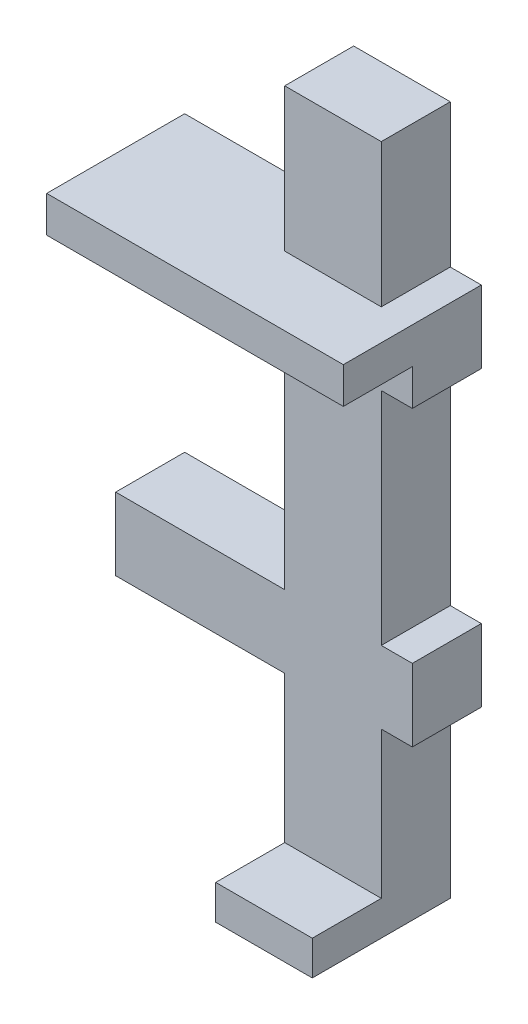
ISO-10303-21;
HEADER;
FILE_DESCRIPTION(('STEP AP214'),'2;1');
FILE_NAME('part.step','',(''),(''),'','','');
FILE_SCHEMA(('AUTOMOTIVE_DESIGN { 1 0 10303 214 1 1 1 1 }'));
ENDSEC;
DATA;
#1=APPLICATION_CONTEXT('core data for automotive mechanical design processes');
#2=APPLICATION_PROTOCOL_DEFINITION('international standard','automotive_design',2000,#1);
#3=PRODUCT_CONTEXT('',#1,'mechanical');
#4=PRODUCT('Part','Part','',(#3));
#5=PRODUCT_RELATED_PRODUCT_CATEGORY('part','',(#4));
#6=PRODUCT_DEFINITION_FORMATION('','',#4);
#7=PRODUCT_DEFINITION_CONTEXT('part definition',#1,'design');
#8=PRODUCT_DEFINITION('design','',#6,#7);
#9=PRODUCT_DEFINITION_SHAPE('','',#8);
#10=(LENGTH_UNIT() NAMED_UNIT(*) SI_UNIT(.MILLI.,.METRE.));
#11=(NAMED_UNIT(*) PLANE_ANGLE_UNIT() SI_UNIT($,.RADIAN.));
#12=(NAMED_UNIT(*) SI_UNIT($,.STERADIAN.) SOLID_ANGLE_UNIT());
#13=UNCERTAINTY_MEASURE_WITH_UNIT(LENGTH_MEASURE(1.E-05),#10,'distance_accuracy_value','');
#14=(GEOMETRIC_REPRESENTATION_CONTEXT(3) GLOBAL_UNCERTAINTY_ASSIGNED_CONTEXT((#13)) GLOBAL_UNIT_ASSIGNED_CONTEXT((#10,
#11,#12)) REPRESENTATION_CONTEXT('',''));
#15=CARTESIAN_POINT('',(0.,0.,0.));
#16=DIRECTION('',(0.,0.,1.));
#17=DIRECTION('',(1.,0.,0.));
#18=AXIS2_PLACEMENT_3D('',#15,#16,#17);
#19=CARTESIAN_POINT('',(0.,0.,4.));
#20=DIRECTION('',(0.,0.,1.));
#21=DIRECTION('',(1.,0.,0.));
#22=AXIS2_PLACEMENT_3D('',#19,#20,#21);
#23=PLANE('',#22);
#24=DIRECTION('',(0.,1.,0.));
#25=VECTOR('',#24,1.);
#26=CARTESIAN_POINT('',(4.6,11.7,4.));
#27=LINE('',#26,#25);
#28=CARTESIAN_POINT('',(4.6,7.5,4.));
#29=VERTEX_POINT('',#28);
#30=CARTESIAN_POINT('',(4.6,9.6,4.));
#31=VERTEX_POINT('',#30);
#32=EDGE_CURVE('E337',#29,#31,#27,.T.);
#33=ORIENTED_EDGE('',*,*,#32,.T.);
#34=DIRECTION('',(1.,0.,0.));
#35=VECTOR('',#34,1.);
#36=CARTESIAN_POINT('',(-12.6,9.6,4.));
#37=LINE('',#36,#35);
#38=CARTESIAN_POINT('',(-12.6,9.6,4.));
#39=VERTEX_POINT('',#38);
#40=EDGE_CURVE('E485',#39,#31,#37,.T.);
#41=ORIENTED_EDGE('',*,*,#40,.F.);
#42=DIRECTION('',(0.,1.,0.));
#43=VECTOR('',#42,1.);
#44=CARTESIAN_POINT('',(-12.6,11.7,4.));
#45=LINE('',#44,#43);
#46=CARTESIAN_POINT('',(-12.6,7.5,4.));
#47=VERTEX_POINT('',#46);
#48=EDGE_CURVE('E238',#47,#39,#45,.T.);
#49=ORIENTED_EDGE('',*,*,#48,.F.);
#50=DIRECTION('',(1.,0.,0.));
#51=VECTOR('',#50,1.);
#52=CARTESIAN_POINT('',(-4.6,7.5,4.));
#53=LINE('',#52,#51);
#54=CARTESIAN_POINT('',(-2.8,7.5,4.));
#55=VERTEX_POINT('',#54);
#56=EDGE_CURVE('E373',#47,#55,#53,.T.);
#57=ORIENTED_EDGE('',*,*,#56,.T.);
#58=DIRECTION('',(0.,1.,0.));
#59=VECTOR('',#58,1.);
#60=CARTESIAN_POINT('',(-2.8,-20.,4.));
#61=LINE('',#60,#59);
#62=CARTESIAN_POINT('',(-2.8,-5.3,4.));
#63=VERTEX_POINT('',#62);
#64=EDGE_CURVE('E422',#63,#55,#61,.T.);
#65=ORIENTED_EDGE('',*,*,#64,.F.);
#66=DIRECTION('',(1.,0.,0.));
#67=VECTOR('',#66,1.);
#68=CARTESIAN_POINT('',(-4.6,-5.3,4.));
#69=LINE('',#68,#67);
#70=CARTESIAN_POINT('',(-12.6,-5.3,4.));
#71=VERTEX_POINT('',#70);
#72=EDGE_CURVE('E318',#71,#63,#69,.T.);
#73=ORIENTED_EDGE('',*,*,#72,.F.);
#74=DIRECTION('',(0.,1.,0.));
#75=VECTOR('',#74,1.);
#76=CARTESIAN_POINT('',(-12.6,-5.3,4.));
#77=LINE('',#76,#75);
#78=CARTESIAN_POINT('',(-12.6,-9.5,4.));
#79=VERTEX_POINT('',#78);
#80=EDGE_CURVE('E245',#79,#71,#77,.T.);
#81=ORIENTED_EDGE('',*,*,#80,.F.);
#82=DIRECTION('',(1.,0.,0.));
#83=VECTOR('',#82,1.);
#84=CARTESIAN_POINT('',(-4.6,-9.5,4.));
#85=LINE('',#84,#83);
#86=CARTESIAN_POINT('',(-2.8,-9.5,4.));
#87=VERTEX_POINT('',#86);
#88=EDGE_CURVE('E321',#79,#87,#85,.T.);
#89=ORIENTED_EDGE('',*,*,#88,.T.);
#90=CARTESIAN_POINT('',(-2.8,-18.,4.));
#91=VERTEX_POINT('',#90);
#92=EDGE_CURVE('E417',#91,#87,#61,.T.);
#93=ORIENTED_EDGE('',*,*,#92,.F.);
#94=DIRECTION('',(-1.,0.,0.));
#95=VECTOR('',#94,1.);
#96=CARTESIAN_POINT('',(-2.8,-18.,4.));
#97=LINE('',#96,#95);
#98=CARTESIAN_POINT('',(2.8,-18.,4.));
#99=VERTEX_POINT('',#98);
#100=EDGE_CURVE('E381',#99,#91,#97,.T.);
#101=ORIENTED_EDGE('',*,*,#100,.F.);
#102=DIRECTION('',(0.,1.,0.));
#103=VECTOR('',#102,1.);
#104=CARTESIAN_POINT('',(2.8,-20.,4.));
#105=LINE('',#104,#103);
#106=CARTESIAN_POINT('',(2.8,-9.5,4.));
#107=VERTEX_POINT('',#106);
#108=EDGE_CURVE('E408',#99,#107,#105,.T.);
#109=ORIENTED_EDGE('',*,*,#108,.T.);
#110=DIRECTION('',(-1.,0.,0.));
#111=VECTOR('',#110,1.);
#112=CARTESIAN_POINT('',(4.6,-9.5,4.));
#113=LINE('',#112,#111);
#114=CARTESIAN_POINT('',(4.6,-9.5,4.));
#115=VERTEX_POINT('',#114);
#116=EDGE_CURVE('E294',#115,#107,#113,.T.);
#117=ORIENTED_EDGE('',*,*,#116,.F.);
#118=DIRECTION('',(0.,-1.,0.));
#119=VECTOR('',#118,1.);
#120=CARTESIAN_POINT('',(4.6,-9.5,4.));
#121=LINE('',#120,#119);
#122=CARTESIAN_POINT('',(4.6,-5.3,4.));
#123=VERTEX_POINT('',#122);
#124=EDGE_CURVE('E280',#123,#115,#121,.T.);
#125=ORIENTED_EDGE('',*,*,#124,.F.);
#126=DIRECTION('',(-1.,0.,0.));
#127=VECTOR('',#126,1.);
#128=CARTESIAN_POINT('',(4.6,-5.3,4.));
#129=LINE('',#128,#127);
#130=CARTESIAN_POINT('',(2.8,-5.3,4.));
#131=VERTEX_POINT('',#130);
#132=EDGE_CURVE('E298',#123,#131,#129,.T.);
#133=ORIENTED_EDGE('',*,*,#132,.T.);
#134=CARTESIAN_POINT('',(2.8,7.5,4.));
#135=VERTEX_POINT('',#134);
#136=EDGE_CURVE('E61',#131,#135,#105,.T.);
#137=ORIENTED_EDGE('',*,*,#136,.T.);
#138=DIRECTION('',(-1.,0.,0.));
#139=VECTOR('',#138,1.);
#140=CARTESIAN_POINT('',(4.6,7.5,4.));
#141=LINE('',#140,#139);
#142=EDGE_CURVE('E354',#29,#135,#141,.T.);
#143=ORIENTED_EDGE('',*,*,#142,.F.);
#144=EDGE_LOOP('',(#33,#41,#49,#57,#65,#73,#81,#89,#93,#101,#109,#117,#125,#133,#137,#143));
#145=FACE_BOUND('',#144,.T.);
#146=ADVANCED_FACE('F45',(#145),#23,.T.);
#147=CARTESIAN_POINT('',(-2.8,11.7,4.));
#148=VERTEX_POINT('',#147);
#149=CARTESIAN_POINT('',(-2.8,20.,4.));
#150=VERTEX_POINT('',#149);
#151=EDGE_CURVE('E416',#148,#150,#61,.T.);
#152=ORIENTED_EDGE('',*,*,#151,.F.);
#153=DIRECTION('',(-1.,0.,0.));
#154=VECTOR('',#153,1.);
#155=CARTESIAN_POINT('',(-12.6,11.7,4.));
#156=LINE('',#155,#154);
#157=CARTESIAN_POINT('',(2.8,11.7,4.));
#158=VERTEX_POINT('',#157);
#159=EDGE_CURVE('E231',#158,#148,#156,.T.);
#160=ORIENTED_EDGE('',*,*,#159,.F.);
#161=CARTESIAN_POINT('',(2.8,20.,4.));
#162=VERTEX_POINT('',#161);
#163=EDGE_CURVE('E412',#158,#162,#105,.T.);
#164=ORIENTED_EDGE('',*,*,#163,.T.);
#165=DIRECTION('',(1.,0.,0.));
#166=VECTOR('',#165,1.);
#167=CARTESIAN_POINT('',(-2.8,20.,4.));
#168=LINE('',#167,#166);
#169=EDGE_CURVE('E411',#150,#162,#168,.T.);
#170=ORIENTED_EDGE('',*,*,#169,.F.);
#171=EDGE_LOOP('',(#152,#160,#164,#170));
#172=FACE_BOUND('',#171,.T.);
#173=ADVANCED_FACE('F467',(#172),#23,.T.);
#174=CARTESIAN_POINT('',(2.8,-20.,4.));
#175=DIRECTION('',(-1.,0.,0.));
#176=DIRECTION('',(0.,0.,1.));
#177=AXIS2_PLACEMENT_3D('',#174,#175,#176);
#178=PLANE('',#177);
#179=DIRECTION('',(0.,0.,1.));
#180=VECTOR('',#179,1.);
#181=CARTESIAN_POINT('',(2.8,-5.3,0.));
#182=LINE('',#181,#180);
#183=CARTESIAN_POINT('',(2.8,-5.3,0.));
#184=VERTEX_POINT('',#183);
#185=EDGE_CURVE('E261',#184,#131,#182,.T.);
#186=ORIENTED_EDGE('',*,*,#185,.F.);
#187=DIRECTION('',(0.,1.,0.));
#188=VECTOR('',#187,1.);
#189=CARTESIAN_POINT('',(2.8,-20.,0.));
#190=LINE('',#189,#188);
#191=CARTESIAN_POINT('',(2.8,7.5,0.));
#192=VERTEX_POINT('',#191);
#193=EDGE_CURVE('E431',#184,#192,#190,.T.);
#194=ORIENTED_EDGE('',*,*,#193,.T.);
#195=DIRECTION('',(0.,0.,1.));
#196=VECTOR('',#195,1.);
#197=CARTESIAN_POINT('',(2.8,7.5,0.));
#198=LINE('',#197,#196);
#199=EDGE_CURVE('E333',#192,#135,#198,.T.);
#200=ORIENTED_EDGE('',*,*,#199,.T.);
#201=ORIENTED_EDGE('',*,*,#136,.F.);
#202=EDGE_LOOP('',(#186,#194,#200,#201));
#203=FACE_BOUND('',#202,.T.);
#204=ADVANCED_FACE('F479',(#203),#178,.F.);
#205=DIRECTION('',(0.,0.,-1.));
#206=VECTOR('',#205,1.);
#207=CARTESIAN_POINT('',(2.8,-9.5,0.));
#208=LINE('',#207,#206);
#209=CARTESIAN_POINT('',(2.8,-9.5,0.));
#210=VERTEX_POINT('',#209);
#211=EDGE_CURVE('E69',#107,#210,#208,.T.);
#212=ORIENTED_EDGE('',*,*,#211,.F.);
#213=ORIENTED_EDGE('',*,*,#108,.F.);
#214=DIRECTION('',(0.,0.,-1.));
#215=VECTOR('',#214,1.);
#216=CARTESIAN_POINT('',(2.8,-18.,8.));
#217=LINE('',#216,#215);
#218=CARTESIAN_POINT('',(2.8,-18.,8.));
#219=VERTEX_POINT('',#218);
#220=EDGE_CURVE('E403',#219,#99,#217,.T.);
#221=ORIENTED_EDGE('',*,*,#220,.F.);
#222=DIRECTION('',(0.,1.,0.));
#223=VECTOR('',#222,1.);
#224=CARTESIAN_POINT('',(2.8,-20.,8.));
#225=LINE('',#224,#223);
#226=CARTESIAN_POINT('',(2.8,-20.,8.));
#227=VERTEX_POINT('',#226);
#228=EDGE_CURVE('E390',#227,#219,#225,.T.);
#229=ORIENTED_EDGE('',*,*,#228,.F.);
#230=DIRECTION('',(0.,0.,-1.));
#231=VECTOR('',#230,1.);
#232=CARTESIAN_POINT('',(2.8,-20.,4.));
#233=LINE('',#232,#231);
#234=CARTESIAN_POINT('',(2.8,-20.,0.));
#235=VERTEX_POINT('',#234);
#236=EDGE_CURVE('E11',#227,#235,#233,.T.);
#237=ORIENTED_EDGE('',*,*,#236,.T.);
#238=EDGE_CURVE('E427',#235,#210,#190,.T.);
#239=ORIENTED_EDGE('',*,*,#238,.T.);
#240=EDGE_LOOP('',(#212,#213,#221,#229,#237,#239));
#241=FACE_BOUND('',#240,.T.);
#242=ADVANCED_FACE('F526',(#241),#178,.F.);
#243=CARTESIAN_POINT('',(-2.8,-20.,4.));
#244=DIRECTION('',(-1.,0.,0.));
#245=DIRECTION('',(0.,0.,1.));
#246=AXIS2_PLACEMENT_3D('',#243,#244,#245);
#247=PLANE('',#246);
#248=DIRECTION('',(0.,0.,-1.));
#249=VECTOR('',#248,1.);
#250=CARTESIAN_POINT('',(-2.8,-9.5,0.));
#251=LINE('',#250,#249);
#252=CARTESIAN_POINT('',(-2.8,-9.5,0.));
#253=VERTEX_POINT('',#252);
#254=EDGE_CURVE('E306',#87,#253,#251,.T.);
#255=ORIENTED_EDGE('',*,*,#254,.T.);
#256=DIRECTION('',(0.,1.,0.));
#257=VECTOR('',#256,1.);
#258=CARTESIAN_POINT('',(-2.8,-20.,0.));
#259=LINE('',#258,#257);
#260=CARTESIAN_POINT('',(-2.8,-20.,0.));
#261=VERTEX_POINT('',#260);
#262=EDGE_CURVE('E436',#261,#253,#259,.T.);
#263=ORIENTED_EDGE('',*,*,#262,.F.);
#264=DIRECTION('',(0.,0.,-1.));
#265=VECTOR('',#264,1.);
#266=CARTESIAN_POINT('',(-2.8,-20.,4.));
#267=LINE('',#266,#265);
#268=CARTESIAN_POINT('',(-2.8,-20.,8.));
#269=VERTEX_POINT('',#268);
#270=EDGE_CURVE('E421',#269,#261,#267,.T.);
#271=ORIENTED_EDGE('',*,*,#270,.F.);
#272=DIRECTION('',(0.,-1.,0.));
#273=VECTOR('',#272,1.);
#274=CARTESIAN_POINT('',(-2.8,-20.,8.));
#275=LINE('',#274,#273);
#276=CARTESIAN_POINT('',(-2.8,-18.,8.));
#277=VERTEX_POINT('',#276);
#278=EDGE_CURVE('E382',#277,#269,#275,.T.);
#279=ORIENTED_EDGE('',*,*,#278,.F.);
#280=DIRECTION('',(0.,0.,-1.));
#281=VECTOR('',#280,1.);
#282=CARTESIAN_POINT('',(-2.8,-18.,8.));
#283=LINE('',#282,#281);
#284=EDGE_CURVE('E396',#277,#91,#283,.T.);
#285=ORIENTED_EDGE('',*,*,#284,.T.);
#286=ORIENTED_EDGE('',*,*,#92,.T.);
#287=EDGE_LOOP('',(#255,#263,#271,#279,#285,#286));
#288=FACE_BOUND('',#287,.T.);
#289=ADVANCED_FACE('F518',(#288),#247,.T.);
#290=DIRECTION('',(0.,0.,-1.));
#291=VECTOR('',#290,1.);
#292=CARTESIAN_POINT('',(-2.8,11.7,0.));
#293=LINE('',#292,#291);
#294=CARTESIAN_POINT('',(-2.8,11.7,0.));
#295=VERTEX_POINT('',#294);
#296=EDGE_CURVE('E365',#148,#295,#293,.T.);
#297=ORIENTED_EDGE('',*,*,#296,.F.);
#298=ORIENTED_EDGE('',*,*,#151,.T.);
#299=DIRECTION('',(0.,0.,-1.));
#300=VECTOR('',#299,1.);
#301=CARTESIAN_POINT('',(-2.8,20.,4.));
#302=LINE('',#301,#300);
#303=CARTESIAN_POINT('',(-2.8,20.,0.));
#304=VERTEX_POINT('',#303);
#305=EDGE_CURVE('E443',#150,#304,#302,.T.);
#306=ORIENTED_EDGE('',*,*,#305,.T.);
#307=EDGE_CURVE('E435',#295,#304,#259,.T.);
#308=ORIENTED_EDGE('',*,*,#307,.F.);
#309=EDGE_LOOP('',(#297,#298,#306,#308));
#310=FACE_BOUND('',#309,.T.);
#311=ADVANCED_FACE('F464',(#310),#247,.T.);
#312=CARTESIAN_POINT('',(-2.8,-20.,4.));
#313=DIRECTION('',(0.,1.,0.));
#314=DIRECTION('',(0.,0.,1.));
#315=AXIS2_PLACEMENT_3D('',#312,#313,#314);
#316=PLANE('',#315);
#317=DIRECTION('',(1.,0.,0.));
#318=VECTOR('',#317,1.);
#319=CARTESIAN_POINT('',(-2.8,-20.,0.));
#320=LINE('',#319,#318);
#321=EDGE_CURVE('E407',#261,#235,#320,.T.);
#322=ORIENTED_EDGE('',*,*,#321,.T.);
#323=ORIENTED_EDGE('',*,*,#236,.F.);
#324=DIRECTION('',(1.,0.,0.));
#325=VECTOR('',#324,1.);
#326=CARTESIAN_POINT('',(-2.8,-20.,8.));
#327=LINE('',#326,#325);
#328=EDGE_CURVE('E386',#269,#227,#327,.T.);
#329=ORIENTED_EDGE('',*,*,#328,.F.);
#330=ORIENTED_EDGE('',*,*,#270,.T.);
#331=EDGE_LOOP('',(#322,#323,#329,#330));
#332=FACE_BOUND('',#331,.T.);
#333=ADVANCED_FACE('F47',(#332),#316,.F.);
#334=ORIENTED_EDGE('',*,*,#163,.F.);
#335=DIRECTION('',(0.,0.,-1.));
#336=VECTOR('',#335,1.);
#337=CARTESIAN_POINT('',(2.8,11.7,0.));
#338=LINE('',#337,#336);
#339=CARTESIAN_POINT('',(2.8,11.7,0.));
#340=VERTEX_POINT('',#339);
#341=EDGE_CURVE('E327',#158,#340,#338,.T.);
#342=ORIENTED_EDGE('',*,*,#341,.T.);
#343=CARTESIAN_POINT('',(2.8,20.,0.));
#344=VERTEX_POINT('',#343);
#345=EDGE_CURVE('E426',#340,#344,#190,.T.);
#346=ORIENTED_EDGE('',*,*,#345,.T.);
#347=DIRECTION('',(0.,0.,-1.));
#348=VECTOR('',#347,1.);
#349=CARTESIAN_POINT('',(2.8,20.,4.));
#350=LINE('',#349,#348);
#351=EDGE_CURVE('E54',#162,#344,#350,.T.);
#352=ORIENTED_EDGE('',*,*,#351,.F.);
#353=EDGE_LOOP('',(#334,#342,#346,#352));
#354=FACE_BOUND('',#353,.T.);
#355=ADVANCED_FACE('F563',(#354),#178,.F.);
#356=CARTESIAN_POINT('',(-2.8,20.,4.));
#357=DIRECTION('',(0.,1.,0.));
#358=DIRECTION('',(0.,0.,1.));
#359=AXIS2_PLACEMENT_3D('',#356,#357,#358);
#360=PLANE('',#359);
#361=DIRECTION('',(1.,0.,0.));
#362=VECTOR('',#361,1.);
#363=CARTESIAN_POINT('',(-2.8,20.,0.));
#364=LINE('',#363,#362);
#365=EDGE_CURVE('E430',#304,#344,#364,.T.);
#366=ORIENTED_EDGE('',*,*,#365,.F.);
#367=ORIENTED_EDGE('',*,*,#305,.F.);
#368=ORIENTED_EDGE('',*,*,#169,.T.);
#369=ORIENTED_EDGE('',*,*,#351,.T.);
#370=EDGE_LOOP('',(#366,#367,#368,#369));
#371=FACE_BOUND('',#370,.T.);
#372=ADVANCED_FACE('F451',(#371),#360,.T.);
#373=DIRECTION('',(0.,0.,1.));
#374=VECTOR('',#373,1.);
#375=CARTESIAN_POINT('',(-2.8,-5.3,0.));
#376=LINE('',#375,#374);
#377=CARTESIAN_POINT('',(-2.8,-5.3,0.));
#378=VERTEX_POINT('',#377);
#379=EDGE_CURVE('E310',#378,#63,#376,.T.);
#380=ORIENTED_EDGE('',*,*,#379,.T.);
#381=ORIENTED_EDGE('',*,*,#64,.T.);
#382=DIRECTION('',(0.,0.,1.));
#383=VECTOR('',#382,1.);
#384=CARTESIAN_POINT('',(-2.8,7.5,0.));
#385=LINE('',#384,#383);
#386=CARTESIAN_POINT('',(-2.8,7.5,0.));
#387=VERTEX_POINT('',#386);
#388=EDGE_CURVE('E361',#387,#55,#385,.T.);
#389=ORIENTED_EDGE('',*,*,#388,.F.);
#390=EDGE_CURVE('E440',#378,#387,#259,.T.);
#391=ORIENTED_EDGE('',*,*,#390,.F.);
#392=EDGE_LOOP('',(#380,#381,#389,#391));
#393=FACE_BOUND('',#392,.T.);
#394=ADVANCED_FACE('F505',(#393),#247,.T.);
#395=CARTESIAN_POINT('',(0.,0.,0.));
#396=DIRECTION('',(0.,0.,1.));
#397=DIRECTION('',(1.,0.,0.));
#398=AXIS2_PLACEMENT_3D('',#395,#396,#397);
#399=PLANE('',#398);
#400=ORIENTED_EDGE('',*,*,#321,.F.);
#401=ORIENTED_EDGE('',*,*,#262,.T.);
#402=DIRECTION('',(1.,0.,0.));
#403=VECTOR('',#402,1.);
#404=CARTESIAN_POINT('',(-4.6,-9.5,0.));
#405=LINE('',#404,#403);
#406=CARTESIAN_POINT('',(-12.6,-9.5,0.));
#407=VERTEX_POINT('',#406);
#408=EDGE_CURVE('E324',#407,#253,#405,.T.);
#409=ORIENTED_EDGE('',*,*,#408,.F.);
#410=DIRECTION('',(0.,-1.,0.));
#411=VECTOR('',#410,1.);
#412=CARTESIAN_POINT('',(-12.6,-5.3,0.));
#413=LINE('',#412,#411);
#414=CARTESIAN_POINT('',(-12.6,-5.3,0.));
#415=VERTEX_POINT('',#414);
#416=EDGE_CURVE('E254',#415,#407,#413,.T.);
#417=ORIENTED_EDGE('',*,*,#416,.F.);
#418=DIRECTION('',(1.,0.,0.));
#419=VECTOR('',#418,1.);
#420=CARTESIAN_POINT('',(-4.6,-5.3,0.));
#421=LINE('',#420,#419);
#422=EDGE_CURVE('E314',#415,#378,#421,.T.);
#423=ORIENTED_EDGE('',*,*,#422,.T.);
#424=ORIENTED_EDGE('',*,*,#390,.T.);
#425=DIRECTION('',(1.,0.,0.));
#426=VECTOR('',#425,1.);
#427=CARTESIAN_POINT('',(-4.6,7.5,0.));
#428=LINE('',#427,#426);
#429=CARTESIAN_POINT('',(-12.6,7.5,0.));
#430=VERTEX_POINT('',#429);
#431=EDGE_CURVE('E377',#430,#387,#428,.T.);
#432=ORIENTED_EDGE('',*,*,#431,.F.);
#433=DIRECTION('',(0.,-1.,0.));
#434=VECTOR('',#433,1.);
#435=CARTESIAN_POINT('',(-12.6,11.7,0.));
#436=LINE('',#435,#434);
#437=CARTESIAN_POINT('',(-12.6,11.7,0.));
#438=VERTEX_POINT('',#437);
#439=EDGE_CURVE('E250',#438,#430,#436,.T.);
#440=ORIENTED_EDGE('',*,*,#439,.F.);
#441=DIRECTION('',(1.,0.,0.));
#442=VECTOR('',#441,1.);
#443=CARTESIAN_POINT('',(-4.6,11.7,0.));
#444=LINE('',#443,#442);
#445=EDGE_CURVE('E369',#438,#295,#444,.T.);
#446=ORIENTED_EDGE('',*,*,#445,.T.);
#447=ORIENTED_EDGE('',*,*,#307,.T.);
#448=ORIENTED_EDGE('',*,*,#365,.T.);
#449=ORIENTED_EDGE('',*,*,#345,.F.);
#450=DIRECTION('',(-1.,0.,0.));
#451=VECTOR('',#450,1.);
#452=CARTESIAN_POINT('',(4.6,11.7,0.));
#453=LINE('',#452,#451);
#454=CARTESIAN_POINT('',(4.6,11.7,0.));
#455=VERTEX_POINT('',#454);
#456=EDGE_CURVE('E358',#455,#340,#453,.T.);
#457=ORIENTED_EDGE('',*,*,#456,.F.);
#458=DIRECTION('',(0.,-1.,0.));
#459=VECTOR('',#458,1.);
#460=CARTESIAN_POINT('',(4.6,11.7,0.));
#461=LINE('',#460,#459);
#462=CARTESIAN_POINT('',(4.6,7.5,0.));
#463=VERTEX_POINT('',#462);
#464=EDGE_CURVE('E328',#455,#463,#461,.T.);
#465=ORIENTED_EDGE('',*,*,#464,.T.);
#466=DIRECTION('',(-1.,0.,0.));
#467=VECTOR('',#466,1.);
#468=CARTESIAN_POINT('',(4.6,7.5,0.));
#469=LINE('',#468,#467);
#470=EDGE_CURVE('E345',#463,#192,#469,.T.);
#471=ORIENTED_EDGE('',*,*,#470,.T.);
#472=ORIENTED_EDGE('',*,*,#193,.F.);
#473=DIRECTION('',(-1.,0.,0.));
#474=VECTOR('',#473,1.);
#475=CARTESIAN_POINT('',(4.6,-5.3,0.));
#476=LINE('',#475,#474);
#477=CARTESIAN_POINT('',(4.6,-5.3,0.));
#478=VERTEX_POINT('',#477);
#479=EDGE_CURVE('E302',#478,#184,#476,.T.);
#480=ORIENTED_EDGE('',*,*,#479,.F.);
#481=DIRECTION('',(0.,1.,0.));
#482=VECTOR('',#481,1.);
#483=CARTESIAN_POINT('',(4.6,-9.5,0.));
#484=LINE('',#483,#482);
#485=CARTESIAN_POINT('',(4.6,-9.5,0.));
#486=VERTEX_POINT('',#485);
#487=EDGE_CURVE('E273',#486,#478,#484,.T.);
#488=ORIENTED_EDGE('',*,*,#487,.F.);
#489=DIRECTION('',(-1.,0.,0.));
#490=VECTOR('',#489,1.);
#491=CARTESIAN_POINT('',(4.6,-9.5,0.));
#492=LINE('',#491,#490);
#493=EDGE_CURVE('E286',#486,#210,#492,.T.);
#494=ORIENTED_EDGE('',*,*,#493,.T.);
#495=ORIENTED_EDGE('',*,*,#238,.F.);
#496=EDGE_LOOP('',(#400,#401,#409,#417,#423,#424,#432,#440,#446,#447,#448,#449,#457,#465,#471,
#472,#480,#488,#494,#495));
#497=FACE_BOUND('',#496,.T.);
#498=ADVANCED_FACE('F459',(#497),#399,.F.);
#499=CARTESIAN_POINT('',(-2.8,-18.,8.));
#500=DIRECTION('',(0.,-1.,0.));
#501=DIRECTION('',(0.,0.,-1.));
#502=AXIS2_PLACEMENT_3D('',#499,#500,#501);
#503=PLANE('',#502);
#504=ORIENTED_EDGE('',*,*,#100,.T.);
#505=ORIENTED_EDGE('',*,*,#284,.F.);
#506=DIRECTION('',(-1.,0.,0.));
#507=VECTOR('',#506,1.);
#508=CARTESIAN_POINT('',(-2.8,-18.,8.));
#509=LINE('',#508,#507);
#510=EDGE_CURVE('E393',#219,#277,#509,.T.);
#511=ORIENTED_EDGE('',*,*,#510,.F.);
#512=ORIENTED_EDGE('',*,*,#220,.T.);
#513=EDGE_LOOP('',(#504,#505,#511,#512));
#514=FACE_BOUND('',#513,.T.);
#515=ADVANCED_FACE('F523',(#514),#503,.F.);
#516=CARTESIAN_POINT('',(0.,0.,8.));
#517=DIRECTION('',(0.,0.,-1.));
#518=DIRECTION('',(-1.,0.,0.));
#519=AXIS2_PLACEMENT_3D('',#516,#517,#518);
#520=PLANE('',#519);
#521=ORIENTED_EDGE('',*,*,#278,.T.);
#522=ORIENTED_EDGE('',*,*,#328,.T.);
#523=ORIENTED_EDGE('',*,*,#228,.T.);
#524=ORIENTED_EDGE('',*,*,#510,.T.);
#525=EDGE_LOOP('',(#521,#522,#523,#524));
#526=FACE_BOUND('',#525,.T.);
#527=ADVANCED_FACE('F529',(#526),#520,.F.);
#528=CARTESIAN_POINT('',(-4.6,7.5,0.));
#529=DIRECTION('',(0.,1.,0.));
#530=DIRECTION('',(0.,0.,1.));
#531=AXIS2_PLACEMENT_3D('',#528,#529,#530);
#532=PLANE('',#531);
#533=ORIENTED_EDGE('',*,*,#388,.T.);
#534=ORIENTED_EDGE('',*,*,#56,.F.);
#535=DIRECTION('',(0.,0.,1.));
#536=VECTOR('',#535,1.);
#537=CARTESIAN_POINT('',(-12.6,7.5,0.));
#538=LINE('',#537,#536);
#539=EDGE_CURVE('E253',#430,#47,#538,.T.);
#540=ORIENTED_EDGE('',*,*,#539,.F.);
#541=ORIENTED_EDGE('',*,*,#431,.T.);
#542=EDGE_LOOP('',(#533,#534,#540,#541));
#543=FACE_BOUND('',#542,.T.);
#544=ADVANCED_FACE('F499',(#543),#532,.F.);
#545=CARTESIAN_POINT('',(-4.6,11.7,0.));
#546=DIRECTION('',(0.,-1.,0.));
#547=DIRECTION('',(0.,0.,-1.));
#548=AXIS2_PLACEMENT_3D('',#545,#546,#547);
#549=PLANE('',#548);
#550=ORIENTED_EDGE('',*,*,#296,.T.);
#551=ORIENTED_EDGE('',*,*,#445,.F.);
#552=DIRECTION('',(0.,0.,-1.));
#553=VECTOR('',#552,1.);
#554=CARTESIAN_POINT('',(-12.6,11.7,0.));
#555=LINE('',#554,#553);
#556=CARTESIAN_POINT('',(-12.6,11.7,8.));
#557=VERTEX_POINT('',#556);
#558=EDGE_CURVE('E259',#557,#438,#555,.T.);
#559=ORIENTED_EDGE('',*,*,#558,.F.);
#560=DIRECTION('',(-1.,0.,0.));
#561=VECTOR('',#560,1.);
#562=CARTESIAN_POINT('',(-12.6,11.7,8.));
#563=LINE('',#562,#561);
#564=CARTESIAN_POINT('',(4.6,11.7,8.));
#565=VERTEX_POINT('',#564);
#566=EDGE_CURVE('E227',#565,#557,#563,.T.);
#567=ORIENTED_EDGE('',*,*,#566,.F.);
#568=DIRECTION('',(0.,0.,-1.));
#569=VECTOR('',#568,1.);
#570=CARTESIAN_POINT('',(4.6,11.7,0.));
#571=LINE('',#570,#569);
#572=EDGE_CURVE('E332',#565,#455,#571,.T.);
#573=ORIENTED_EDGE('',*,*,#572,.T.);
#574=ORIENTED_EDGE('',*,*,#456,.T.);
#575=ORIENTED_EDGE('',*,*,#341,.F.);
#576=ORIENTED_EDGE('',*,*,#159,.T.);
#577=EDGE_LOOP('',(#550,#551,#559,#567,#573,#574,#575,#576));
#578=FACE_BOUND('',#577,.T.);
#579=ADVANCED_FACE('F494',(#578),#549,.F.);
#580=CARTESIAN_POINT('',(4.6,7.5,0.));
#581=DIRECTION('',(0.,-1.,0.));
#582=DIRECTION('',(0.,0.,-1.));
#583=AXIS2_PLACEMENT_3D('',#580,#581,#582);
#584=PLANE('',#583);
#585=ORIENTED_EDGE('',*,*,#199,.F.);
#586=ORIENTED_EDGE('',*,*,#470,.F.);
#587=DIRECTION('',(0.,0.,1.));
#588=VECTOR('',#587,1.);
#589=CARTESIAN_POINT('',(4.6,7.5,0.));
#590=LINE('',#589,#588);
#591=EDGE_CURVE('E341',#463,#29,#590,.T.);
#592=ORIENTED_EDGE('',*,*,#591,.T.);
#593=ORIENTED_EDGE('',*,*,#142,.T.);
#594=EDGE_LOOP('',(#585,#586,#592,#593));
#595=FACE_BOUND('',#594,.T.);
#596=ADVANCED_FACE('F477',(#595),#584,.T.);
#597=CARTESIAN_POINT('',(4.6,0.,0.));
#598=DIRECTION('',(1.,0.,0.));
#599=DIRECTION('',(0.,0.,1.));
#600=AXIS2_PLACEMENT_3D('',#597,#598,#599);
#601=PLANE('',#600);
#602=ORIENTED_EDGE('',*,*,#464,.F.);
#603=ORIENTED_EDGE('',*,*,#572,.F.);
#604=DIRECTION('',(0.,1.,0.));
#605=VECTOR('',#604,1.);
#606=CARTESIAN_POINT('',(4.6,11.7,8.));
#607=LINE('',#606,#605);
#608=CARTESIAN_POINT('',(4.6,9.6,8.));
#609=VERTEX_POINT('',#608);
#610=EDGE_CURVE('E220',#609,#565,#607,.T.);
#611=ORIENTED_EDGE('',*,*,#610,.F.);
#612=DIRECTION('',(0.,0.,-1.));
#613=VECTOR('',#612,1.);
#614=CARTESIAN_POINT('',(4.6,9.6,8.));
#615=LINE('',#614,#613);
#616=EDGE_CURVE('E215',#609,#31,#615,.T.);
#617=ORIENTED_EDGE('',*,*,#616,.T.);
#618=ORIENTED_EDGE('',*,*,#32,.F.);
#619=ORIENTED_EDGE('',*,*,#591,.F.);
#620=EDGE_LOOP('',(#602,#603,#611,#617,#618,#619));
#621=FACE_BOUND('',#620,.T.);
#622=ADVANCED_FACE('F484',(#621),#601,.T.);
#623=CARTESIAN_POINT('',(-4.6,-9.5,0.));
#624=DIRECTION('',(0.,-1.,0.));
#625=DIRECTION('',(0.,0.,-1.));
#626=AXIS2_PLACEMENT_3D('',#623,#624,#625);
#627=PLANE('',#626);
#628=ORIENTED_EDGE('',*,*,#254,.F.);
#629=ORIENTED_EDGE('',*,*,#88,.F.);
#630=DIRECTION('',(0.,0.,1.));
#631=VECTOR('',#630,1.);
#632=CARTESIAN_POINT('',(-12.6,-9.5,0.));
#633=LINE('',#632,#631);
#634=EDGE_CURVE('E266',#407,#79,#633,.T.);
#635=ORIENTED_EDGE('',*,*,#634,.F.);
#636=ORIENTED_EDGE('',*,*,#408,.T.);
#637=EDGE_LOOP('',(#628,#629,#635,#636));
#638=FACE_BOUND('',#637,.T.);
#639=ADVANCED_FACE('F515',(#638),#627,.T.);
#640=CARTESIAN_POINT('',(-4.6,-5.3,0.));
#641=DIRECTION('',(0.,1.,0.));
#642=DIRECTION('',(0.,0.,1.));
#643=AXIS2_PLACEMENT_3D('',#640,#641,#642);
#644=PLANE('',#643);
#645=ORIENTED_EDGE('',*,*,#379,.F.);
#646=ORIENTED_EDGE('',*,*,#422,.F.);
#647=DIRECTION('',(0.,0.,-1.));
#648=VECTOR('',#647,1.);
#649=CARTESIAN_POINT('',(-12.6,-5.3,0.));
#650=LINE('',#649,#648);
#651=EDGE_CURVE('E240',#71,#415,#650,.T.);
#652=ORIENTED_EDGE('',*,*,#651,.F.);
#653=ORIENTED_EDGE('',*,*,#72,.T.);
#654=EDGE_LOOP('',(#645,#646,#652,#653));
#655=FACE_BOUND('',#654,.T.);
#656=ADVANCED_FACE('F507',(#655),#644,.T.);
#657=CARTESIAN_POINT('',(4.6,-5.3,0.));
#658=DIRECTION('',(0.,-1.,0.));
#659=DIRECTION('',(0.,0.,-1.));
#660=AXIS2_PLACEMENT_3D('',#657,#658,#659);
#661=PLANE('',#660);
#662=ORIENTED_EDGE('',*,*,#185,.T.);
#663=ORIENTED_EDGE('',*,*,#132,.F.);
#664=DIRECTION('',(0.,0.,1.));
#665=VECTOR('',#664,1.);
#666=CARTESIAN_POINT('',(4.6,-5.3,0.));
#667=LINE('',#666,#665);
#668=EDGE_CURVE('E277',#478,#123,#667,.T.);
#669=ORIENTED_EDGE('',*,*,#668,.F.);
#670=ORIENTED_EDGE('',*,*,#479,.T.);
#671=EDGE_LOOP('',(#662,#663,#669,#670));
#672=FACE_BOUND('',#671,.T.);
#673=ADVANCED_FACE('F540',(#672),#661,.F.);
#674=CARTESIAN_POINT('',(4.6,-9.5,0.));
#675=DIRECTION('',(0.,1.,0.));
#676=DIRECTION('',(0.,0.,1.));
#677=AXIS2_PLACEMENT_3D('',#674,#675,#676);
#678=PLANE('',#677);
#679=ORIENTED_EDGE('',*,*,#211,.T.);
#680=ORIENTED_EDGE('',*,*,#493,.F.);
#681=DIRECTION('',(0.,0.,-1.));
#682=VECTOR('',#681,1.);
#683=CARTESIAN_POINT('',(4.6,-9.5,0.));
#684=LINE('',#683,#682);
#685=EDGE_CURVE('E283',#115,#486,#684,.T.);
#686=ORIENTED_EDGE('',*,*,#685,.F.);
#687=ORIENTED_EDGE('',*,*,#116,.T.);
#688=EDGE_LOOP('',(#679,#680,#686,#687));
#689=FACE_BOUND('',#688,.T.);
#690=ADVANCED_FACE('F535',(#689),#678,.F.);
#691=CARTESIAN_POINT('',(4.6,2.2,0.));
#692=DIRECTION('',(1.,0.,0.));
#693=DIRECTION('',(0.,0.,1.));
#694=AXIS2_PLACEMENT_3D('',#691,#692,#693);
#695=PLANE('',#694);
#696=ORIENTED_EDGE('',*,*,#487,.T.);
#697=ORIENTED_EDGE('',*,*,#668,.T.);
#698=ORIENTED_EDGE('',*,*,#124,.T.);
#699=ORIENTED_EDGE('',*,*,#685,.T.);
#700=EDGE_LOOP('',(#696,#697,#698,#699));
#701=FACE_BOUND('',#700,.T.);
#702=ADVANCED_FACE('F538',(#701),#695,.T.);
#703=CARTESIAN_POINT('',(-12.6,0.,0.));
#704=DIRECTION('',(-1.,0.,0.));
#705=DIRECTION('',(0.,0.,1.));
#706=AXIS2_PLACEMENT_3D('',#703,#704,#705);
#707=PLANE('',#706);
#708=ORIENTED_EDGE('',*,*,#416,.T.);
#709=ORIENTED_EDGE('',*,*,#634,.T.);
#710=ORIENTED_EDGE('',*,*,#80,.T.);
#711=ORIENTED_EDGE('',*,*,#651,.T.);
#712=EDGE_LOOP('',(#708,#709,#710,#711));
#713=FACE_BOUND('',#712,.T.);
#714=ADVANCED_FACE('F512',(#713),#707,.T.);
#715=CARTESIAN_POINT('',(-12.6,0.,0.));
#716=DIRECTION('',(-1.,0.,0.));
#717=DIRECTION('',(0.,0.,1.));
#718=AXIS2_PLACEMENT_3D('',#715,#716,#717);
#719=PLANE('',#718);
#720=ORIENTED_EDGE('',*,*,#439,.T.);
#721=ORIENTED_EDGE('',*,*,#539,.T.);
#722=ORIENTED_EDGE('',*,*,#48,.T.);
#723=DIRECTION('',(0.,0.,-1.));
#724=VECTOR('',#723,1.);
#725=CARTESIAN_POINT('',(-12.6,9.6,8.));
#726=LINE('',#725,#724);
#727=CARTESIAN_POINT('',(-12.6,9.6,8.));
#728=VERTEX_POINT('',#727);
#729=EDGE_CURVE('E212',#728,#39,#726,.T.);
#730=ORIENTED_EDGE('',*,*,#729,.F.);
#731=DIRECTION('',(0.,-1.,0.));
#732=VECTOR('',#731,1.);
#733=CARTESIAN_POINT('',(-12.6,11.7,8.));
#734=LINE('',#733,#732);
#735=EDGE_CURVE('E221',#557,#728,#734,.T.);
#736=ORIENTED_EDGE('',*,*,#735,.F.);
#737=ORIENTED_EDGE('',*,*,#558,.T.);
#738=EDGE_LOOP('',(#720,#721,#722,#730,#736,#737));
#739=FACE_BOUND('',#738,.T.);
#740=ADVANCED_FACE('F235',(#739),#719,.T.);
#741=CARTESIAN_POINT('',(-12.6,9.6,8.));
#742=DIRECTION('',(0.,1.,0.));
#743=DIRECTION('',(0.,0.,1.));
#744=AXIS2_PLACEMENT_3D('',#741,#742,#743);
#745=PLANE('',#744);
#746=ORIENTED_EDGE('',*,*,#40,.T.);
#747=ORIENTED_EDGE('',*,*,#616,.F.);
#748=DIRECTION('',(1.,0.,0.));
#749=VECTOR('',#748,1.);
#750=CARTESIAN_POINT('',(-12.6,9.6,8.));
#751=LINE('',#750,#749);
#752=EDGE_CURVE('E208',#728,#609,#751,.T.);
#753=ORIENTED_EDGE('',*,*,#752,.F.);
#754=ORIENTED_EDGE('',*,*,#729,.T.);
#755=EDGE_LOOP('',(#746,#747,#753,#754));
#756=FACE_BOUND('',#755,.T.);
#757=ADVANCED_FACE('F210',(#756),#745,.F.);
#758=CARTESIAN_POINT('',(0.,0.,8.));
#759=DIRECTION('',(0.,0.,1.));
#760=DIRECTION('',(1.,0.,0.));
#761=AXIS2_PLACEMENT_3D('',#758,#759,#760);
#762=PLANE('',#761);
#763=ORIENTED_EDGE('',*,*,#735,.T.);
#764=ORIENTED_EDGE('',*,*,#752,.T.);
#765=ORIENTED_EDGE('',*,*,#610,.T.);
#766=ORIENTED_EDGE('',*,*,#566,.T.);
#767=EDGE_LOOP('',(#763,#764,#765,#766));
#768=FACE_BOUND('',#767,.T.);
#769=ADVANCED_FACE('F225',(#768),#762,.T.);
#770=CLOSED_SHELL('',(#146,#173,#204,#242,#289,#311,#333,#355,#372,#394,#498,#515,#527,#544,
#579,#596,#622,#639,#656,#673,#690,#702,#714,#740,#757,#769));
#771=MANIFOLD_SOLID_BREP('B2',#770);
#772=ADVANCED_BREP_SHAPE_REPRESENTATION('',(#18,#771),#14);
#773=SHAPE_DEFINITION_REPRESENTATION(#9,#772);
ENDSEC;
END-ISO-10303-21;
